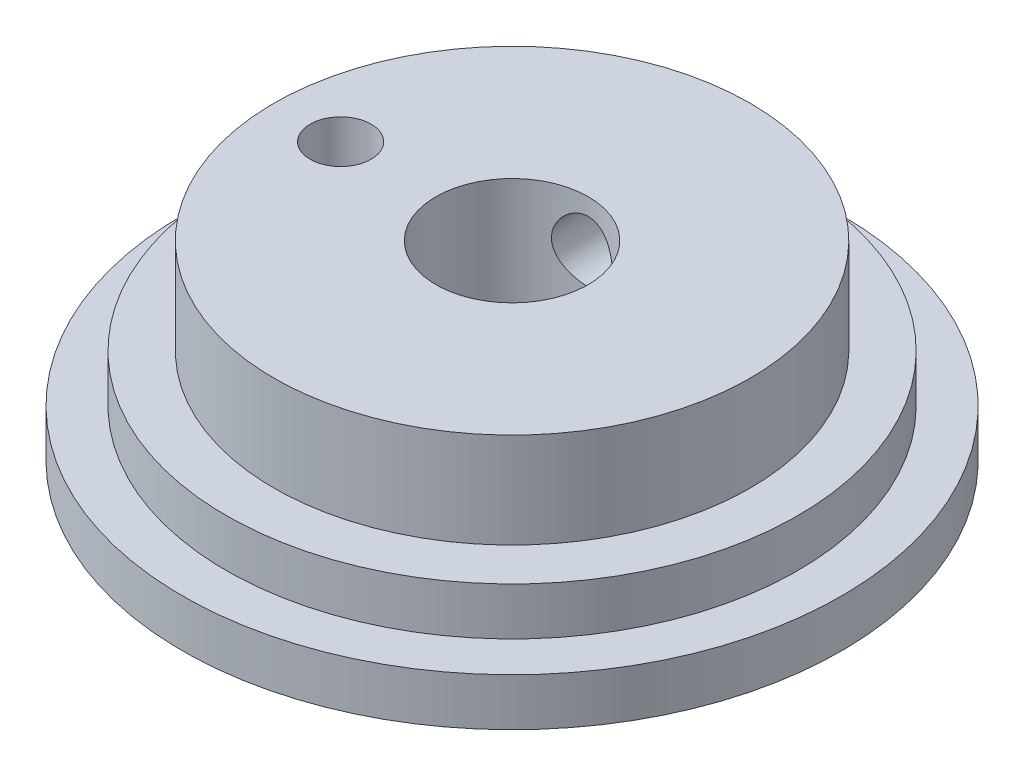
ISO-10303-21;
HEADER;
FILE_DESCRIPTION(('STEP AP214'),'2;1');
FILE_NAME('part.step','',(''),(''),'','','');
FILE_SCHEMA(('AUTOMOTIVE_DESIGN { 1 0 10303 214 1 1 1 1 }'));
ENDSEC;
DATA;
#1=APPLICATION_CONTEXT('core data for automotive mechanical design processes');
#2=APPLICATION_PROTOCOL_DEFINITION('international standard','automotive_design',2000,#1);
#3=PRODUCT_CONTEXT('',#1,'mechanical');
#4=PRODUCT('Part','Part','',(#3));
#5=PRODUCT_RELATED_PRODUCT_CATEGORY('part','',(#4));
#6=PRODUCT_DEFINITION_FORMATION('','',#4);
#7=PRODUCT_DEFINITION_CONTEXT('part definition',#1,'design');
#8=PRODUCT_DEFINITION('design','',#6,#7);
#9=PRODUCT_DEFINITION_SHAPE('','',#8);
#10=(LENGTH_UNIT() NAMED_UNIT(*) SI_UNIT(.MILLI.,.METRE.));
#11=(NAMED_UNIT(*) PLANE_ANGLE_UNIT() SI_UNIT($,.RADIAN.));
#12=(NAMED_UNIT(*) SI_UNIT($,.STERADIAN.) SOLID_ANGLE_UNIT());
#13=UNCERTAINTY_MEASURE_WITH_UNIT(LENGTH_MEASURE(1.E-05),#10,'distance_accuracy_value','');
#14=(GEOMETRIC_REPRESENTATION_CONTEXT(3) GLOBAL_UNCERTAINTY_ASSIGNED_CONTEXT((#13)) GLOBAL_UNIT_ASSIGNED_CONTEXT((#10,
#11,#12)) REPRESENTATION_CONTEXT('',''));
#15=CARTESIAN_POINT('',(0.,0.,0.));
#16=DIRECTION('',(0.,0.,1.));
#17=DIRECTION('',(1.,0.,0.));
#18=AXIS2_PLACEMENT_3D('',#15,#16,#17);
#19=CARTESIAN_POINT('',(0.,5.,0.));
#20=DIRECTION('',(0.,-1.,0.));
#21=DIRECTION('',(0.,0.,-1.));
#22=AXIS2_PLACEMENT_3D('',#19,#20,#21);
#23=PLANE('',#22);
#24=CARTESIAN_POINT('',(0.,5.,0.));
#25=DIRECTION('',(0.,-1.,0.));
#26=DIRECTION('',(0.,0.,-1.));
#27=AXIS2_PLACEMENT_3D('',#24,#25,#26);
#28=CIRCLE('',#27,15.);
#29=CARTESIAN_POINT('',(0.,5.,-15.));
#30=VERTEX_POINT('',#29);
#31=EDGE_CURVE('E10',#30,#30,#28,.T.);
#32=ORIENTED_EDGE('',*,*,#31,.F.);
#33=EDGE_LOOP('',(#32));
#34=FACE_BOUND('',#33,.T.);
#35=CARTESIAN_POINT('',(0.,5.,0.));
#36=DIRECTION('',(0.,-1.,0.));
#37=DIRECTION('',(0.,0.,-1.));
#38=AXIS2_PLACEMENT_3D('',#35,#36,#37);
#39=CIRCLE('',#38,12.5);
#40=CARTESIAN_POINT('',(0.,5.,-12.5));
#41=VERTEX_POINT('',#40);
#42=EDGE_CURVE('E68',#41,#41,#39,.T.);
#43=ORIENTED_EDGE('',*,*,#42,.T.);
#44=EDGE_LOOP('',(#43));
#45=FACE_BOUND('',#44,.T.);
#46=ADVANCED_FACE('F35',(#34,#45),#23,.F.);
#47=CARTESIAN_POINT('',(0.,0.,0.));
#48=DIRECTION('',(0.,-1.,0.));
#49=DIRECTION('',(0.,0.,-1.));
#50=AXIS2_PLACEMENT_3D('',#47,#48,#49);
#51=CYLINDRICAL_SURFACE('',#50,15.);
#52=CARTESIAN_POINT('',(0.,2.5,0.));
#53=DIRECTION('',(0.,-1.,0.));
#54=DIRECTION('',(0.,0.,-1.));
#55=AXIS2_PLACEMENT_3D('',#52,#53,#54);
#56=CIRCLE('',#55,15.);
#57=CARTESIAN_POINT('',(0.,2.5,-15.));
#58=VERTEX_POINT('',#57);
#59=EDGE_CURVE('E47',#58,#58,#56,.T.);
#60=ORIENTED_EDGE('',*,*,#59,.F.);
#61=EDGE_LOOP('',(#60));
#62=FACE_BOUND('',#61,.T.);
#63=ORIENTED_EDGE('',*,*,#31,.T.);
#64=EDGE_LOOP('',(#63));
#65=FACE_BOUND('',#64,.T.);
#66=ADVANCED_FACE('F106',(#62,#65),#51,.T.);
#67=CARTESIAN_POINT('',(0.,2.5,0.));
#68=DIRECTION('',(0.,1.,0.));
#69=DIRECTION('',(0.,0.,1.));
#70=AXIS2_PLACEMENT_3D('',#67,#68,#69);
#71=PLANE('',#70);
#72=ORIENTED_EDGE('',*,*,#59,.T.);
#73=EDGE_LOOP('',(#72));
#74=FACE_BOUND('',#73,.T.);
#75=CARTESIAN_POINT('',(0.,2.5,0.));
#76=DIRECTION('',(0.,-1.,0.));
#77=DIRECTION('',(0.,0.,-1.));
#78=AXIS2_PLACEMENT_3D('',#75,#76,#77);
#79=CIRCLE('',#78,17.3);
#80=CARTESIAN_POINT('',(0.,2.5,-17.3));
#81=VERTEX_POINT('',#80);
#82=EDGE_CURVE('E51',#81,#81,#79,.T.);
#83=ORIENTED_EDGE('',*,*,#82,.F.);
#84=EDGE_LOOP('',(#83));
#85=FACE_BOUND('',#84,.T.);
#86=ADVANCED_FACE('F111',(#74,#85),#71,.T.);
#87=CARTESIAN_POINT('',(0.,0.,0.));
#88=DIRECTION('',(0.,-1.,0.));
#89=DIRECTION('',(0.,0.,-1.));
#90=AXIS2_PLACEMENT_3D('',#87,#88,#89);
#91=CYLINDRICAL_SURFACE('',#90,17.3);
#92=CARTESIAN_POINT('',(0.,0.,0.));
#93=DIRECTION('',(0.,-1.,0.));
#94=DIRECTION('',(0.,0.,-1.));
#95=AXIS2_PLACEMENT_3D('',#92,#93,#94);
#96=CIRCLE('',#95,17.3);
#97=CARTESIAN_POINT('',(0.,0.,-17.3));
#98=VERTEX_POINT('',#97);
#99=EDGE_CURVE('E56',#98,#98,#96,.T.);
#100=ORIENTED_EDGE('',*,*,#99,.F.);
#101=EDGE_LOOP('',(#100));
#102=FACE_BOUND('',#101,.T.);
#103=ORIENTED_EDGE('',*,*,#82,.T.);
#104=EDGE_LOOP('',(#103));
#105=FACE_BOUND('',#104,.T.);
#106=ADVANCED_FACE('F124',(#102,#105),#91,.T.);
#107=CARTESIAN_POINT('',(0.,0.,0.));
#108=DIRECTION('',(0.,-1.,0.));
#109=DIRECTION('',(0.,0.,-1.));
#110=AXIS2_PLACEMENT_3D('',#107,#108,#109);
#111=PLANE('',#110);
#112=CARTESIAN_POINT('',(-9.,0.,0.));
#113=DIRECTION('',(0.,1.,0.));
#114=DIRECTION('',(0.,0.,1.));
#115=AXIS2_PLACEMENT_3D('',#112,#113,#114);
#116=CIRCLE('',#115,1.6);
#117=CARTESIAN_POINT('',(-9.,0.,1.6));
#118=VERTEX_POINT('',#117);
#119=EDGE_CURVE('E138',#118,#118,#116,.T.);
#120=ORIENTED_EDGE('',*,*,#119,.T.);
#121=EDGE_LOOP('',(#120));
#122=FACE_BOUND('',#121,.T.);
#123=ORIENTED_EDGE('',*,*,#99,.T.);
#124=EDGE_LOOP('',(#123));
#125=FACE_BOUND('',#124,.T.);
#126=CARTESIAN_POINT('',(0.,0.,0.));
#127=DIRECTION('',(0.,-1.,0.));
#128=DIRECTION('',(0.,0.,-1.));
#129=AXIS2_PLACEMENT_3D('',#126,#127,#128);
#130=CIRCLE('',#129,4.);
#131=CARTESIAN_POINT('',(0.,0.,-4.));
#132=VERTEX_POINT('',#131);
#133=EDGE_CURVE('E59',#132,#132,#130,.T.);
#134=ORIENTED_EDGE('',*,*,#133,.F.);
#135=EDGE_LOOP('',(#134));
#136=FACE_BOUND('',#135,.T.);
#137=ADVANCED_FACE('F101',(#122,#125,#136),#111,.T.);
#138=CARTESIAN_POINT('',(0.,0.,0.));
#139=DIRECTION('',(0.,-1.,0.));
#140=DIRECTION('',(0.,0.,-1.));
#141=AXIS2_PLACEMENT_3D('',#138,#139,#140);
#142=CYLINDRICAL_SURFACE('',#141,4.);
#143=CARTESIAN_POINT('',(0.,9.1,-4.));
#144=CARTESIAN_POINT('',(-0.085994404354313,9.09999211854102,-3.99999416981668));
#145=CARTESIAN_POINT('',(-0.172138051272538,9.0930257983293,-3.99719435445546));
#146=CARTESIAN_POINT('',(-0.341997184334316,9.06540183718301,-3.98626762480513));
#147=CARTESIAN_POINT('',(-0.425705422048998,9.0447069767311,-3.97812622959102));
#148=CARTESIAN_POINT('',(-0.587963138181923,8.99049913755294,-3.95739367370495));
#149=CARTESIAN_POINT('',(-0.666528529293568,8.95702812302662,-3.94481709091258));
#150=CARTESIAN_POINT('',(-0.816857576262694,8.87838466133876,-3.91645288636862));
#151=CARTESIAN_POINT('',(-0.888623581400793,8.83321627606486,-3.90066637966445));
#152=CARTESIAN_POINT('',(-1.02680080605631,8.73021160115125,-3.86664708936335));
#153=CARTESIAN_POINT('',(-1.09284981804017,8.67191467500779,-3.84833837543352));
#154=CARTESIAN_POINT('',(-1.21454000382778,8.54527999721858,-3.81168461524956));
#155=CARTESIAN_POINT('',(-1.27017608570683,8.47693736223061,-3.79333955563034));
#156=CARTESIAN_POINT('',(-1.3718996538343,8.32845754380619,-3.75778233437709));
#157=CARTESIAN_POINT('',(-1.41745198495638,8.24793081118144,-3.74065692771961));
#158=CARTESIAN_POINT('',(-1.49420377522972,8.07957088126397,-3.71066917749434));
#159=CARTESIAN_POINT('',(-1.52541005142867,7.99174117772131,-3.69780480995341));
#160=CARTESIAN_POINT('',(-1.57111905871669,7.81543013312632,-3.67861086128655));
#161=CARTESIAN_POINT('',(-1.58631517264452,7.72715901153903,-3.67201136284484));
#162=CARTESIAN_POINT('',(-1.60173836931202,7.54909200135419,-3.66531203239315));
#163=CARTESIAN_POINT('',(-1.60197281305058,7.45929688429999,-3.66520900418215));
#164=CARTESIAN_POINT('',(-1.58799149400364,7.28739466283356,-3.67128400223995));
#165=CARTESIAN_POINT('',(-1.57478025144411,7.20518742847278,-3.6770254003076));
#166=CARTESIAN_POINT('',(-1.53595750423825,7.04427235519463,-3.69340950086269));
#167=CARTESIAN_POINT('',(-1.5103438358437,6.96556512951175,-3.70405305857338));
#168=CARTESIAN_POINT('',(-1.44695578604086,6.81198573104317,-3.72927588070824));
#169=CARTESIAN_POINT('',(-1.40894388985225,6.73722460875625,-3.7439310342463));
#170=CARTESIAN_POINT('',(-1.32200516858577,6.59486734691075,-3.77550493111912));
#171=CARTESIAN_POINT('',(-1.27307424408067,6.52727391247775,-3.79242452365479));
#172=CARTESIAN_POINT('',(-1.16124047956355,6.3956722169584,-3.82821389393817));
#173=CARTESIAN_POINT('',(-1.09754997037651,6.33234501644319,-3.84713331980921));
#174=CARTESIAN_POINT('',(-0.960251541944153,6.21705241759837,-3.88367859966626));
#175=CARTESIAN_POINT('',(-0.886641652267546,6.16508928207177,-3.9013041955626));
#176=CARTESIAN_POINT('',(-0.729662122084674,6.07310604206733,-3.93371745011639));
#177=CARTESIAN_POINT('',(-0.646128393077181,6.03334217504236,-3.94844216076332));
#178=CARTESIAN_POINT('',(-0.472819012386305,5.96866571113756,-3.97291862663007));
#179=CARTESIAN_POINT('',(-0.383046557479738,5.94374556995407,-3.98267290769906));
#180=CARTESIAN_POINT('',(-0.205516710086255,5.91084136366424,-3.99564911605528));
#181=CARTESIAN_POINT('',(-0.117954635188426,5.90194203659715,-3.99922356666811));
#182=CARTESIAN_POINT('',(0.0574762478462552,5.89862951957711,-4.00054782808505));
#183=CARTESIAN_POINT('',(0.14534497057914,5.90421257476199,-3.99829914865833));
#184=CARTESIAN_POINT('',(0.314746191297591,5.92903340204159,-3.98846053651002));
#185=CARTESIAN_POINT('',(0.396385993420381,5.94764638428078,-3.98111513076419));
#186=CARTESIAN_POINT('',(0.555308342448626,5.99714856664785,-3.962075531244));
#187=CARTESIAN_POINT('',(0.632590328179877,6.02803934373495,-3.95038077885224));
#188=CARTESIAN_POINT('',(0.783263028653363,6.10222795174396,-3.92333275816649));
#189=CARTESIAN_POINT('',(0.856462418204326,6.14587637763452,-3.90787852783843));
#190=CARTESIAN_POINT('',(0.994754872997246,6.24395225912452,-3.8749869179642));
#191=CARTESIAN_POINT('',(1.0598446726089,6.29838403433809,-3.85754874488216));
#192=CARTESIAN_POINT('',(1.18457843442306,6.4206960103597,-3.82116094110489));
#193=CARTESIAN_POINT('',(1.24357914704485,6.48922683320497,-3.80218753140042));
#194=CARTESIAN_POINT('',(1.34940095793097,6.6355520664075,-3.76593338333706));
#195=CARTESIAN_POINT('',(1.39622004907001,6.71334800027196,-3.74865292421209));
#196=CARTESIAN_POINT('',(1.4766460015453,6.87716935567529,-3.71771439926167));
#197=CARTESIAN_POINT('',(1.51012047562756,6.96326719936985,-3.7040930470783));
#198=CARTESIAN_POINT('',(1.56183697576424,7.14058692137213,-3.68258938782345));
#199=CARTESIAN_POINT('',(1.58009024421545,7.23180496464994,-3.67470284556799));
#200=CARTESIAN_POINT('',(1.59977249382272,7.40970232141964,-3.66617407439941));
#201=CARTESIAN_POINT('',(1.60231766584229,7.49623587167468,-3.66505136806537));
#202=CARTESIAN_POINT('',(1.59344252742202,7.66843588617064,-3.66891868826478));
#203=CARTESIAN_POINT('',(1.58202399033102,7.75410245912207,-3.67390793859835));
#204=CARTESIAN_POINT('',(1.54645709292292,7.91866575188404,-3.68901319263217));
#205=CARTESIAN_POINT('',(1.52282999485678,7.9976962195464,-3.69891865461959));
#206=CARTESIAN_POINT('',(1.46400435879281,8.15070290369079,-3.72259200986157));
#207=CARTESIAN_POINT('',(1.42880262511505,8.22467771751986,-3.73636096964805));
#208=CARTESIAN_POINT('',(1.34549821020778,8.37008769541663,-3.76718887683593));
#209=CARTESIAN_POINT('',(1.29677226812759,8.44113493610439,-3.78439105850594));
#210=CARTESIAN_POINT('',(1.18871369541719,8.57439465376301,-3.8197104349779));
#211=CARTESIAN_POINT('',(1.1293778678545,8.63660445770266,-3.83782790438725));
#212=CARTESIAN_POINT('',(0.997204405017968,8.75456228261089,-3.87434853669915));
#213=CARTESIAN_POINT('',(0.923740800916909,8.80962984551846,-3.89269406369748));
#214=CARTESIAN_POINT('',(0.767920256228622,8.90666963409731,-3.92640325370973));
#215=CARTESIAN_POINT('',(0.685559203637789,8.94863576972203,-3.94176552874325));
#216=CARTESIAN_POINT('',(0.515790449996162,9.01729777215223,-3.96751771852689));
#217=CARTESIAN_POINT('',(0.428505294575756,9.04426345884827,-3.97799490444022));
#218=CARTESIAN_POINT('',(0.250301237024976,9.08291129676341,-3.99315444967493));
#219=CARTESIAN_POINT('',(0.159394820687129,9.09464194939512,-3.9978551959651));
#220=CARTESIAN_POINT('',(0.0455298383127432,9.09951630478262,-3.99980719603309));
#221=CARTESIAN_POINT('',(0.0227701509926064,9.10000208690336,-4.00000154375341));
#222=CARTESIAN_POINT('',(0.,9.1,-4.));
#223=B_SPLINE_CURVE_WITH_KNOTS('',3,(#143,#144,#145,#146,#147,#148,#149,#150,#151,#152,#153,
#154,#155,#156,#157,#158,#159,#160,#161,#162,#163,#164,#165,#166,#167,#168,#169,#170,#171,#172,
#173,#174,#175,#176,#177,#178,#179,#180,#181,#182,#183,#184,#185,#186,#187,#188,#189,#190,#191,
#192,#193,#194,#195,#196,#197,#198,#199,#200,#201,#202,#203,#204,#205,#206,#207,#208,#209,#210,
#211,#212,#213,#214,#215,#216,#217,#218,#219,#220,#221,#222),.UNSPECIFIED.,.T.,.F.,(4,2,2,2,2,2,
2,2,2,2,2,2,2,2,2,2,2,2,2,2,2,2,2,2,2,2,2,2,2,2,2,2,2,2,2,2,2,2,2,4),(0.,0.257922390314457,
0.516546908806348,0.774329165977265,1.03202202854387,1.30077905360318,1.56966715947529,
1.85052207055373,2.13124338494614,2.39923284247063,2.6670904507239,2.91630662721098,
3.16556629804838,3.41991301039053,3.67435537550547,3.94846679349246,4.22263274271786,
4.50221530530245,4.78165564891032,5.04455347622406,5.30738314856066,5.55840364451493,
5.80945639195037,6.0681881071861,6.32702367599175,6.60294779699531,6.87891735234999,
7.15756036112662,7.43599738116747,7.69439738714198,7.95276458050437,8.20091454839015,
8.4491330864413,8.71156374445354,8.97407361078715,9.25360338827069,9.53326290912427,
9.80771440810655,10.0812900192347,10.1495843671744),.UNSPECIFIED.);
#224=CARTESIAN_POINT('',(0.,9.1,-4.));
#225=VERTEX_POINT('',#224);
#226=EDGE_CURVE('E71',#225,#225,#223,.T.);
#227=ORIENTED_EDGE('',*,*,#226,.F.);
#228=EDGE_LOOP('',(#227));
#229=FACE_BOUND('',#228,.T.);
#230=ORIENTED_EDGE('',*,*,#133,.T.);
#231=EDGE_LOOP('',(#230));
#232=FACE_BOUND('',#231,.T.);
#233=CARTESIAN_POINT('',(0.,10.,0.));
#234=DIRECTION('',(0.,-1.,0.));
#235=DIRECTION('',(0.,0.,-1.));
#236=AXIS2_PLACEMENT_3D('',#233,#234,#235);
#237=CIRCLE('',#236,4.);
#238=CARTESIAN_POINT('',(0.,10.,-4.));
#239=VERTEX_POINT('',#238);
#240=EDGE_CURVE('E62',#239,#239,#237,.T.);
#241=ORIENTED_EDGE('',*,*,#240,.F.);
#242=EDGE_LOOP('',(#241));
#243=FACE_BOUND('',#242,.T.);
#244=ADVANCED_FACE('F80',(#229,#232,#243),#142,.F.);
#245=CARTESIAN_POINT('',(0.,10.,0.));
#246=DIRECTION('',(0.,-1.,0.));
#247=DIRECTION('',(0.,0.,-1.));
#248=AXIS2_PLACEMENT_3D('',#245,#246,#247);
#249=PLANE('',#248);
#250=CARTESIAN_POINT('',(-9.,10.,0.));
#251=DIRECTION('',(0.,1.,0.));
#252=DIRECTION('',(0.,0.,1.));
#253=AXIS2_PLACEMENT_3D('',#250,#251,#252);
#254=CIRCLE('',#253,1.6);
#255=CARTESIAN_POINT('',(-9.,10.,1.6));
#256=VERTEX_POINT('',#255);
#257=EDGE_CURVE('E78',#256,#256,#254,.T.);
#258=ORIENTED_EDGE('',*,*,#257,.F.);
#259=EDGE_LOOP('',(#258));
#260=FACE_BOUND('',#259,.T.);
#261=CARTESIAN_POINT('',(0.,10.,0.));
#262=DIRECTION('',(0.,-1.,0.));
#263=DIRECTION('',(0.,0.,-1.));
#264=AXIS2_PLACEMENT_3D('',#261,#262,#263);
#265=CIRCLE('',#264,12.5);
#266=CARTESIAN_POINT('',(0.,10.,-12.5));
#267=VERTEX_POINT('',#266);
#268=EDGE_CURVE('E65',#267,#267,#265,.T.);
#269=ORIENTED_EDGE('',*,*,#268,.F.);
#270=EDGE_LOOP('',(#269));
#271=FACE_BOUND('',#270,.T.);
#272=ORIENTED_EDGE('',*,*,#240,.T.);
#273=EDGE_LOOP('',(#272));
#274=FACE_BOUND('',#273,.T.);
#275=ADVANCED_FACE('F94',(#260,#271,#274),#249,.F.);
#276=CARTESIAN_POINT('',(0.,0.,0.));
#277=DIRECTION('',(0.,-1.,0.));
#278=DIRECTION('',(0.,0.,-1.));
#279=AXIS2_PLACEMENT_3D('',#276,#277,#278);
#280=CYLINDRICAL_SURFACE('',#279,12.5);
#281=CARTESIAN_POINT('',(0.,9.1,-12.5));
#282=CARTESIAN_POINT('',(-0.089480228581626,9.09999620967844,-12.4999987273405));
#283=CARTESIAN_POINT('',(-0.179015931675331,9.09246839578163,-12.499029056014));
#284=CARTESIAN_POINT('',(-0.355594628622663,9.06255800254797,-12.4952541222134));
#285=CARTESIAN_POINT('',(-0.44263494147155,9.040160028126,-12.4924469574237));
#286=CARTESIAN_POINT('',(-0.611641054255219,8.98118108672698,-12.4853131928751));
#287=CARTESIAN_POINT('',(-0.693610272484019,8.94460979712003,-12.4809876300497));
#288=CARTESIAN_POINT('',(-0.850232699633243,8.85834380168914,-12.4712978138664));
#289=CARTESIAN_POINT('',(-0.92488713401849,8.80865129926813,-12.4659337349434));
#290=CARTESIAN_POINT('',(-1.0652061611174,8.69724751808118,-12.4547309610872));
#291=CARTESIAN_POINT('',(-1.1308225327694,8.63547572738356,-12.4488899665847));
#292=CARTESIAN_POINT('',(-1.25078744700972,8.50179681121915,-12.437410158438));
#293=CARTESIAN_POINT('',(-1.30513540756856,8.42988916254297,-12.4317713552498));
#294=CARTESIAN_POINT('',(-1.40120131878558,8.27766511768412,-12.4213117857827));
#295=CARTESIAN_POINT('',(-1.44287391980583,8.19731988094322,-12.4164939832712));
#296=CARTESIAN_POINT('',(-1.51211654458473,8.03069940043074,-12.4082523672039));
#297=CARTESIAN_POINT('',(-1.53968712861921,7.94442439240461,-12.4048284982681));
#298=CARTESIAN_POINT('',(-1.57979618302578,7.7688946901791,-12.3997844564613));
#299=CARTESIAN_POINT('',(-1.59241621355555,7.67965891876555,-12.3981545007017));
#300=CARTESIAN_POINT('',(-1.60251833190295,7.50032233106304,-12.3968529255545));
#301=CARTESIAN_POINT('',(-1.6000010570764,7.41022155135471,-12.3971812237147));
#302=CARTESIAN_POINT('',(-1.57996693859598,7.23228183611033,-12.3997501103633));
#303=CARTESIAN_POINT('',(-1.56254004625942,7.14443258388437,-12.4019792307219));
#304=CARTESIAN_POINT('',(-1.51332177543579,6.97291569892478,-12.4080807060494));
#305=CARTESIAN_POINT('',(-1.48153009300948,6.88924815471194,-12.4119530957876));
#306=CARTESIAN_POINT('',(-1.40438835528283,6.72819089610096,-12.420917754726));
#307=CARTESIAN_POINT('',(-1.35899932073846,6.65082005430809,-12.4260135225035));
#308=CARTESIAN_POINT('',(-1.2559791774554,6.50475931740199,-12.436848087927));
#309=CARTESIAN_POINT('',(-1.19834748171951,6.43606983878486,-12.4425869163993));
#310=CARTESIAN_POINT('',(-1.07197998078475,6.30879964922306,-12.4541119267274));
#311=CARTESIAN_POINT('',(-1.00316666356942,6.25029587679709,-12.4598981501205));
#312=CARTESIAN_POINT('',(-0.8566558603769,6.14565723817514,-12.4708270736414));
#313=CARTESIAN_POINT('',(-0.778958352182545,6.0995224029118,-12.47596977216));
#314=CARTESIAN_POINT('',(-0.616824567175368,6.02093075032636,-12.4850356169908));
#315=CARTESIAN_POINT('',(-0.532385869092662,5.98847887411384,-12.4889583226125));
#316=CARTESIAN_POINT('',(-0.35919633701333,5.93823604801821,-12.4951382424324));
#317=CARTESIAN_POINT('',(-0.270445714989223,5.92044437821569,-12.4973955384135));
#318=CARTESIAN_POINT('',(-0.0918167515699818,5.90012700959609,-12.4999796501206));
#319=CARTESIAN_POINT('',(-0.00195064871834219,5.89749534784533,-12.5003198651777));
#320=CARTESIAN_POINT('',(0.176941336110661,5.90729288149859,-12.4990676925075));
#321=CARTESIAN_POINT('',(0.265967236826347,5.91972174021674,-12.4974753479835));
#322=CARTESIAN_POINT('',(0.440338117066495,5.95919946579896,-12.4925453163349));
#323=CARTESIAN_POINT('',(0.525694748548654,5.98619768618058,-12.4892136767036));
#324=CARTESIAN_POINT('',(0.690668995940679,6.05399501584474,-12.4811779750741));
#325=CARTESIAN_POINT('',(0.770286408285865,6.09479461435722,-12.4764738644255));
#326=CARTESIAN_POINT('',(0.921994603640622,6.18929205705904,-12.4661840779527));
#327=CARTESIAN_POINT('',(0.994042464202556,6.24305829818892,-12.4605937831078));
#328=CARTESIAN_POINT('',(1.12812939052349,6.36186620841611,-12.449171101846));
#329=CARTESIAN_POINT('',(1.19016803872729,6.42690834767634,-12.4433387053422));
#330=CARTESIAN_POINT('',(1.30285251542755,6.5668890712877,-12.4320476984862));
#331=CARTESIAN_POINT('',(1.35342801356351,6.6418844975014,-12.4265915313144));
#332=CARTESIAN_POINT('',(1.4412643372584,6.79936771524115,-12.4167112819757));
#333=CARTESIAN_POINT('',(1.47852544058671,6.88185535041719,-12.412287178278));
#334=CARTESIAN_POINT('',(1.53856194060305,7.05175644772714,-12.4049887339945));
#335=CARTESIAN_POINT('',(1.56137669650311,7.13915581334674,-12.402110185814));
#336=CARTESIAN_POINT('',(1.59199947328775,7.31658438483018,-12.3982168029281));
#337=CARTESIAN_POINT('',(1.59980822902681,7.40661346169601,-12.3972018769598));
#338=CARTESIAN_POINT('',(1.60018341763843,7.58604603654271,-12.3971533974092));
#339=CARTESIAN_POINT('',(1.59286034966409,7.67544931965463,-12.3981054798688));
#340=CARTESIAN_POINT('',(1.56341406955244,7.85174304618621,-12.4018528226023));
#341=CARTESIAN_POINT('',(1.5412908582596,7.93863348974923,-12.4046480827711));
#342=CARTESIAN_POINT('',(1.48290735295564,8.10741869827694,-12.4117623181005));
#343=CARTESIAN_POINT('',(1.44665265140134,8.18931542466838,-12.4160806904338));
#344=CARTESIAN_POINT('',(1.36104616807924,8.34588076445767,-12.4257555410229));
#345=CARTESIAN_POINT('',(1.31169419076938,8.42054926991562,-12.4311120347776));
#346=CARTESIAN_POINT('',(1.20088500594448,8.56110311430291,-12.4423064236852));
#347=CARTESIAN_POINT('',(1.13934548813475,8.62692331925844,-12.4481474258925));
#348=CARTESIAN_POINT('',(1.00608024349136,8.74734465846945,-12.4596254256836));
#349=CARTESIAN_POINT('',(0.934352122786101,8.80194314871966,-12.4652623749325));
#350=CARTESIAN_POINT('',(0.782416832255793,8.89855763892584,-12.4757220565273));
#351=CARTESIAN_POINT('',(0.702177023493941,8.94052264875535,-12.4805414558997));
#352=CARTESIAN_POINT('',(0.535771337736572,9.01032195627665,-12.4887894105534));
#353=CARTESIAN_POINT('',(0.44961198188554,9.03817152925444,-12.4922194685257));
#354=CARTESIAN_POINT('',(0.302510950691842,9.07232134620842,-12.4964802335958));
#355=CARTESIAN_POINT('',(0.242494895059006,9.08268582111949,-12.4977936774923));
#356=CARTESIAN_POINT('',(0.121661104986523,9.09652640954901,-12.4995539899657));
#357=CARTESIAN_POINT('',(0.0608433768604799,9.10000257728402,-12.5000008653632));
#358=CARTESIAN_POINT('',(0.,9.1,-12.5));
#359=B_SPLINE_CURVE_WITH_KNOTS('',3,(#281,#282,#283,#284,#285,#286,#287,#288,#289,#290,#291,
#292,#293,#294,#295,#296,#297,#298,#299,#300,#301,#302,#303,#304,#305,#306,#307,#308,#309,#310,
#311,#312,#313,#314,#315,#316,#317,#318,#319,#320,#321,#322,#323,#324,#325,#326,#327,#328,#329,
#330,#331,#332,#333,#334,#335,#336,#337,#338,#339,#340,#341,#342,#343,#344,#345,#346,#347,#348,
#349,#350,#351,#352,#353,#354,#355,#356,#357,#358),.UNSPECIFIED.,.T.,.F.,(4,2,2,2,2,2,2,2,2,2,2,
2,2,2,2,2,2,2,2,2,2,2,2,2,2,2,2,2,2,2,2,2,2,2,2,2,2,2,4),(0.,0.268218434758675,
0.536714990137084,0.80502854134721,1.07329706415196,1.34294561260607,1.61260808532342,
1.88322429991686,2.1538297620413,2.42295208338281,2.69206307341599,2.95956184546622,
3.22706627768815,3.49534501926247,3.76363662686556,4.0338743020149,4.30411265297677,
4.57444850741439,4.84477108566594,5.11320189318709,5.38162669990669,5.64912435462915,
5.91663149257689,6.18558179759111,6.45454331952937,6.7251128495115,6.99567673445154,
7.26550025725746,7.53531056627733,7.80315756768864,8.07100455381704,8.33874564846965,
8.6064907407163,8.87610985931487,9.14579243160439,9.41654931327233,9.68701256131166,
9.86939300460507,10.0517720124108),.UNSPECIFIED.);
#360=CARTESIAN_POINT('',(0.,9.1,-12.5));
#361=VERTEX_POINT('',#360);
#362=EDGE_CURVE('E38',#361,#361,#359,.T.);
#363=ORIENTED_EDGE('',*,*,#362,.T.);
#364=EDGE_LOOP('',(#363));
#365=FACE_BOUND('',#364,.T.);
#366=ORIENTED_EDGE('',*,*,#42,.F.);
#367=EDGE_LOOP('',(#366));
#368=FACE_BOUND('',#367,.T.);
#369=ORIENTED_EDGE('',*,*,#268,.T.);
#370=EDGE_LOOP('',(#369));
#371=FACE_BOUND('',#370,.T.);
#372=ADVANCED_FACE('F89',(#365,#368,#371),#280,.T.);
#373=CARTESIAN_POINT('',(0.,7.5,-17.3));
#374=DIRECTION('',(0.,0.,1.));
#375=DIRECTION('',(1.,0.,0.));
#376=AXIS2_PLACEMENT_3D('',#373,#374,#375);
#377=CYLINDRICAL_SURFACE('',#376,1.6);
#378=ORIENTED_EDGE('',*,*,#226,.T.);
#379=EDGE_LOOP('',(#378));
#380=FACE_BOUND('',#379,.T.);
#381=ORIENTED_EDGE('',*,*,#362,.F.);
#382=EDGE_LOOP('',(#381));
#383=FACE_BOUND('',#382,.T.);
#384=ADVANCED_FACE('F84',(#380,#383),#377,.F.);
#385=CARTESIAN_POINT('',(-9.,0.,0.));
#386=DIRECTION('',(0.,1.,0.));
#387=DIRECTION('',(0.,0.,1.));
#388=AXIS2_PLACEMENT_3D('',#385,#386,#387);
#389=CYLINDRICAL_SURFACE('',#388,1.6);
#390=ORIENTED_EDGE('',*,*,#119,.F.);
#391=EDGE_LOOP('',(#390));
#392=FACE_BOUND('',#391,.T.);
#393=ORIENTED_EDGE('',*,*,#257,.T.);
#394=EDGE_LOOP('',(#393));
#395=FACE_BOUND('',#394,.T.);
#396=ADVANCED_FACE('F88',(#392,#395),#389,.F.);
#397=CLOSED_SHELL('',(#46,#66,#86,#106,#137,#244,#275,#372,#384,#396));
#398=MANIFOLD_SOLID_BREP('B2',#397);
#399=ADVANCED_BREP_SHAPE_REPRESENTATION('',(#18,#398),#14);
#400=SHAPE_DEFINITION_REPRESENTATION(#9,#399);
ENDSEC;
END-ISO-10303-21;
